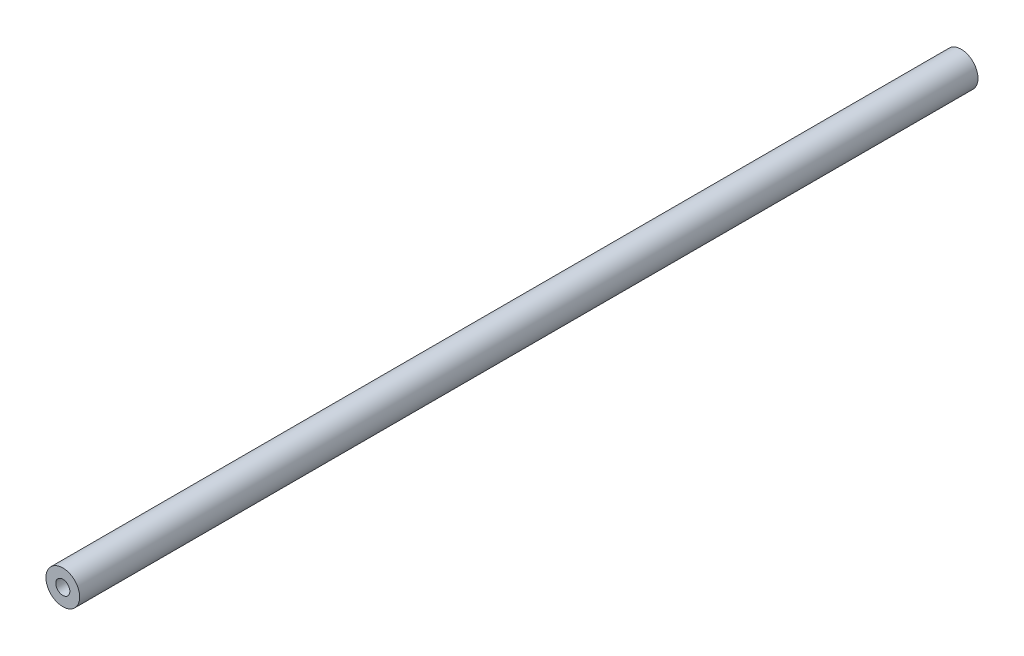
ISO-10303-21;
HEADER;
FILE_DESCRIPTION(('STEP AP214'),'2;1');
FILE_NAME('part.step','',(''),(''),'','','');
FILE_SCHEMA(('AUTOMOTIVE_DESIGN { 1 0 10303 214 1 1 1 1 }'));
ENDSEC;
DATA;
#1=APPLICATION_CONTEXT('core data for automotive mechanical design processes');
#2=APPLICATION_PROTOCOL_DEFINITION('international standard','automotive_design',2000,#1);
#3=PRODUCT_CONTEXT('',#1,'mechanical');
#4=PRODUCT('Part','Part','',(#3));
#5=PRODUCT_RELATED_PRODUCT_CATEGORY('part','',(#4));
#6=PRODUCT_DEFINITION_FORMATION('','',#4);
#7=PRODUCT_DEFINITION_CONTEXT('part definition',#1,'design');
#8=PRODUCT_DEFINITION('design','',#6,#7);
#9=PRODUCT_DEFINITION_SHAPE('','',#8);
#10=(LENGTH_UNIT() NAMED_UNIT(*) SI_UNIT(.MILLI.,.METRE.));
#11=(NAMED_UNIT(*) PLANE_ANGLE_UNIT() SI_UNIT($,.RADIAN.));
#12=(NAMED_UNIT(*) SI_UNIT($,.STERADIAN.) SOLID_ANGLE_UNIT());
#13=UNCERTAINTY_MEASURE_WITH_UNIT(LENGTH_MEASURE(1.E-05),#10,'distance_accuracy_value','');
#14=(GEOMETRIC_REPRESENTATION_CONTEXT(3) GLOBAL_UNCERTAINTY_ASSIGNED_CONTEXT((#13)) GLOBAL_UNIT_ASSIGNED_CONTEXT((#10,
#11,#12)) REPRESENTATION_CONTEXT('',''));
#15=CARTESIAN_POINT('',(0.,0.,0.));
#16=DIRECTION('',(0.,0.,1.));
#17=DIRECTION('',(1.,0.,0.));
#18=AXIS2_PLACEMENT_3D('',#15,#16,#17);
#19=CARTESIAN_POINT('',(0.,0.,-320.));
#20=DIRECTION('',(0.,0.,1.));
#21=DIRECTION('',(1.,0.,0.));
#22=AXIS2_PLACEMENT_3D('',#19,#20,#21);
#23=CYLINDRICAL_SURFACE('',#22,6.);
#24=CARTESIAN_POINT('',(0.,0.,-320.));
#25=DIRECTION('',(0.,0.,1.));
#26=DIRECTION('',(1.,0.,0.));
#27=AXIS2_PLACEMENT_3D('',#24,#25,#26);
#28=CIRCLE('',#27,6.);
#29=CARTESIAN_POINT('',(6.,0.,-320.));
#30=VERTEX_POINT('',#29);
#31=EDGE_CURVE('E12',#30,#30,#28,.T.);
#32=ORIENTED_EDGE('',*,*,#31,.T.);
#33=EDGE_LOOP('',(#32));
#34=FACE_BOUND('',#33,.T.);
#35=CARTESIAN_POINT('',(0.,0.,0.));
#36=DIRECTION('',(0.,0.,1.));
#37=DIRECTION('',(1.,0.,0.));
#38=AXIS2_PLACEMENT_3D('',#35,#36,#37);
#39=CIRCLE('',#38,6.);
#40=CARTESIAN_POINT('',(6.,0.,0.));
#41=VERTEX_POINT('',#40);
#42=EDGE_CURVE('E47',#41,#41,#39,.T.);
#43=ORIENTED_EDGE('',*,*,#42,.F.);
#44=EDGE_LOOP('',(#43));
#45=FACE_BOUND('',#44,.T.);
#46=ADVANCED_FACE('F44',(#34,#45),#23,.T.);
#47=CARTESIAN_POINT('',(0.,0.,-320.));
#48=DIRECTION('',(0.,0.,1.));
#49=DIRECTION('',(1.,0.,0.));
#50=AXIS2_PLACEMENT_3D('',#47,#48,#49);
#51=PLANE('',#50);
#52=CARTESIAN_POINT('',(0.,0.,-320.));
#53=DIRECTION('',(0.,0.,1.));
#54=DIRECTION('',(1.,0.,0.));
#55=AXIS2_PLACEMENT_3D('',#52,#53,#54);
#56=CIRCLE('',#55,2.5);
#57=CARTESIAN_POINT('',(2.5,0.,-320.));
#58=VERTEX_POINT('',#57);
#59=EDGE_CURVE('E54',#58,#58,#56,.T.);
#60=ORIENTED_EDGE('',*,*,#59,.T.);
#61=EDGE_LOOP('',(#60));
#62=FACE_BOUND('',#61,.T.);
#63=ORIENTED_EDGE('',*,*,#31,.F.);
#64=EDGE_LOOP('',(#63));
#65=FACE_BOUND('',#64,.T.);
#66=ADVANCED_FACE('F62',(#62,#65),#51,.F.);
#67=CARTESIAN_POINT('',(0.,0.,0.));
#68=DIRECTION('',(0.,0.,1.));
#69=DIRECTION('',(1.,0.,0.));
#70=AXIS2_PLACEMENT_3D('',#67,#68,#69);
#71=PLANE('',#70);
#72=CARTESIAN_POINT('',(0.,0.,0.));
#73=DIRECTION('',(0.,0.,1.));
#74=DIRECTION('',(1.,0.,0.));
#75=AXIS2_PLACEMENT_3D('',#72,#73,#74);
#76=CIRCLE('',#75,2.5);
#77=CARTESIAN_POINT('',(2.5,0.,0.));
#78=VERTEX_POINT('',#77);
#79=EDGE_CURVE('E56',#78,#78,#76,.T.);
#80=ORIENTED_EDGE('',*,*,#79,.F.);
#81=EDGE_LOOP('',(#80));
#82=FACE_BOUND('',#81,.T.);
#83=ORIENTED_EDGE('',*,*,#42,.T.);
#84=EDGE_LOOP('',(#83));
#85=FACE_BOUND('',#84,.T.);
#86=ADVANCED_FACE('F68',(#82,#85),#71,.T.);
#87=CARTESIAN_POINT('',(0.,0.,-320.));
#88=DIRECTION('',(0.,0.,1.));
#89=DIRECTION('',(1.,0.,0.));
#90=AXIS2_PLACEMENT_3D('',#87,#88,#89);
#91=CYLINDRICAL_SURFACE('',#90,2.5);
#92=ORIENTED_EDGE('',*,*,#59,.F.);
#93=EDGE_LOOP('',(#92));
#94=FACE_BOUND('',#93,.T.);
#95=ORIENTED_EDGE('',*,*,#79,.T.);
#96=EDGE_LOOP('',(#95));
#97=FACE_BOUND('',#96,.T.);
#98=ADVANCED_FACE('F65',(#94,#97),#91,.F.);
#99=CLOSED_SHELL('',(#46,#66,#86,#98));
#100=MANIFOLD_SOLID_BREP('B2',#99);
#101=ADVANCED_BREP_SHAPE_REPRESENTATION('',(#18,#100),#14);
#102=SHAPE_DEFINITION_REPRESENTATION(#9,#101);
ENDSEC;
END-ISO-10303-21;
